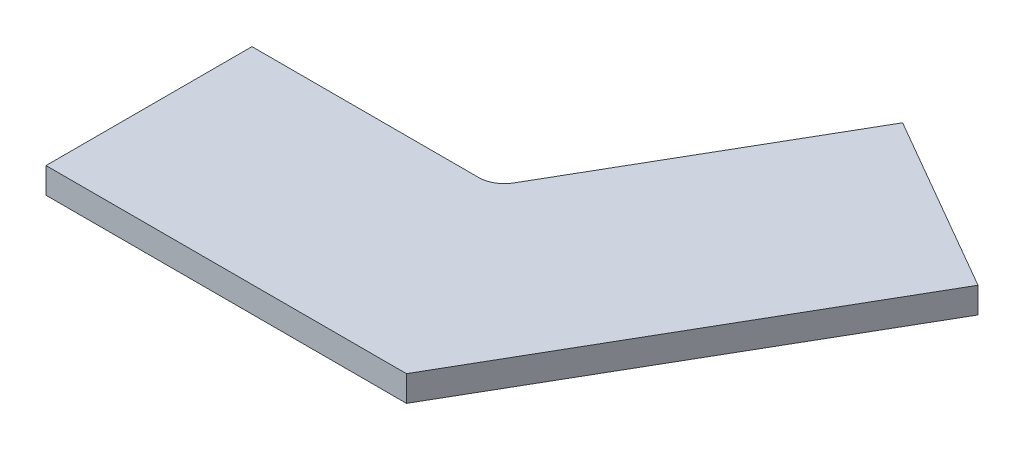
ISO-10303-21;
HEADER;
FILE_DESCRIPTION(('STEP AP214'),'2;1');
FILE_NAME('part.step','',(''),(''),'','','');
FILE_SCHEMA(('AUTOMOTIVE_DESIGN { 1 0 10303 214 1 1 1 1 }'));
ENDSEC;
DATA;
#1=APPLICATION_CONTEXT('core data for automotive mechanical design processes');
#2=APPLICATION_PROTOCOL_DEFINITION('international standard','automotive_design',2000,#1);
#3=PRODUCT_CONTEXT('',#1,'mechanical');
#4=PRODUCT('Part','Part','',(#3));
#5=PRODUCT_RELATED_PRODUCT_CATEGORY('part','',(#4));
#6=PRODUCT_DEFINITION_FORMATION('','',#4);
#7=PRODUCT_DEFINITION_CONTEXT('part definition',#1,'design');
#8=PRODUCT_DEFINITION('design','',#6,#7);
#9=PRODUCT_DEFINITION_SHAPE('','',#8);
#10=(LENGTH_UNIT() NAMED_UNIT(*) SI_UNIT(.MILLI.,.METRE.));
#11=(NAMED_UNIT(*) PLANE_ANGLE_UNIT() SI_UNIT($,.RADIAN.));
#12=(NAMED_UNIT(*) SI_UNIT($,.STERADIAN.) SOLID_ANGLE_UNIT());
#13=UNCERTAINTY_MEASURE_WITH_UNIT(LENGTH_MEASURE(1.E-05),#10,'distance_accuracy_value','');
#14=(GEOMETRIC_REPRESENTATION_CONTEXT(3) GLOBAL_UNCERTAINTY_ASSIGNED_CONTEXT((#13)) GLOBAL_UNIT_ASSIGNED_CONTEXT((#10,
#11,#12)) REPRESENTATION_CONTEXT('',''));
#15=CARTESIAN_POINT('',(0.,0.,0.));
#16=DIRECTION('',(0.,0.,1.));
#17=DIRECTION('',(1.,0.,0.));
#18=AXIS2_PLACEMENT_3D('',#15,#16,#17);
#19=CARTESIAN_POINT('',(0.,6.35,0.));
#20=DIRECTION('',(0.,1.,0.));
#21=DIRECTION('',(0.,0.,1.));
#22=AXIS2_PLACEMENT_3D('',#19,#20,#21);
#23=PLANE('',#22);
#24=DIRECTION('',(-0.500000000000017,0.,0.866025403784429));
#25=VECTOR('',#24,1.);
#26=CARTESIAN_POINT('',(7.59965948774994,6.35,-114.762996353));
#27=LINE('',#26,#25);
#28=CARTESIAN_POINT('',(-27.4963065701523,6.35,-53.9750000000121));
#29=VERTEX_POINT('',#28);
#30=CARTESIAN_POINT('',(7.59965948775127,6.35,-114.762996353001));
#31=VERTEX_POINT('',#30);
#32=EDGE_CURVE('E62',#29,#31,#27,.F.);
#33=ORIENTED_EDGE('',*,*,#32,.F.);
#34=CARTESIAN_POINT('',(-32.9955678841958,6.35,-57.15));
#35=DIRECTION('',(0.,1.,0.));
#36=DIRECTION('',(0.,0.,1.));
#37=AXIS2_PLACEMENT_3D('',#34,#35,#36);
#38=CIRCLE('',#37,6.35);
#39=CARTESIAN_POINT('',(-32.9955678841958,6.35,-50.8));
#40=VERTEX_POINT('',#39);
#41=EDGE_CURVE('E36',#29,#40,#38,.F.);
#42=ORIENTED_EDGE('',*,*,#41,.T.);
#43=DIRECTION('',(-1.,0.,0.));
#44=VECTOR('',#43,1.);
#45=CARTESIAN_POINT('',(-29.3293936748266,6.35,-50.8));
#46=LINE('',#45,#44);
#47=CARTESIAN_POINT('',(-88.9,6.35,-50.8000000000003));
#48=VERTEX_POINT('',#47);
#49=EDGE_CURVE('E114',#48,#40,#46,.F.);
#50=ORIENTED_EDGE('',*,*,#49,.F.);
#51=DIRECTION('',(0.,0.,1.));
#52=VECTOR('',#51,1.);
#53=CARTESIAN_POINT('',(-88.9,6.35,-50.8));
#54=LINE('',#53,#52);
#55=CARTESIAN_POINT('',(-88.9,6.35,0.));
#56=VERTEX_POINT('',#55);
#57=EDGE_CURVE('E103',#56,#48,#54,.F.);
#58=ORIENTED_EDGE('',*,*,#57,.F.);
#59=DIRECTION('',(1.,0.,0.));
#60=VECTOR('',#59,1.);
#61=CARTESIAN_POINT('',(-88.9,6.35,0.));
#62=LINE('',#61,#60);
#63=CARTESIAN_POINT('',(0.,6.35,0.));
#64=VERTEX_POINT('',#63);
#65=EDGE_CURVE('E111',#64,#56,#62,.F.);
#66=ORIENTED_EDGE('',*,*,#65,.F.);
#67=DIRECTION('',(0.500000000000017,0.,-0.866025403784429));
#68=VECTOR('',#67,1.);
#69=CARTESIAN_POINT('',(0.,6.35,0.));
#70=LINE('',#69,#68);
#71=CARTESIAN_POINT('',(51.5937499999988,6.35,-89.3629963530003));
#72=VERTEX_POINT('',#71);
#73=EDGE_CURVE('E138',#72,#64,#70,.F.);
#74=ORIENTED_EDGE('',*,*,#73,.F.);
#75=DIRECTION('',(-0.866025403784429,0.,-0.500000000000017));
#76=VECTOR('',#75,1.);
#77=CARTESIAN_POINT('',(51.59375,6.35,-89.3629963529996));
#78=LINE('',#77,#76);
#79=EDGE_CURVE('E135',#31,#72,#78,.F.);
#80=ORIENTED_EDGE('',*,*,#79,.F.);
#81=EDGE_LOOP('',(#33,#42,#50,#58,#66,#74,#80));
#82=FACE_BOUND('',#81,.T.);
#83=ADVANCED_FACE('F33',(#82),#23,.T.);
#84=CARTESIAN_POINT('',(-88.9,0.,-50.8));
#85=DIRECTION('',(-1.,0.,0.));
#86=DIRECTION('',(0.,0.,1.));
#87=AXIS2_PLACEMENT_3D('',#84,#85,#86);
#88=PLANE('',#87);
#89=DIRECTION('',(0.,0.,1.));
#90=VECTOR('',#89,1.);
#91=CARTESIAN_POINT('',(-88.9,0.,0.));
#92=LINE('',#91,#90);
#93=CARTESIAN_POINT('',(-88.9,0.,-50.8000000000003));
#94=VERTEX_POINT('',#93);
#95=CARTESIAN_POINT('',(-88.9,0.,0.));
#96=VERTEX_POINT('',#95);
#97=EDGE_CURVE('E86',#94,#96,#92,.T.);
#98=ORIENTED_EDGE('',*,*,#97,.T.);
#99=DIRECTION('',(0.,1.,0.));
#100=VECTOR('',#99,1.);
#101=CARTESIAN_POINT('',(-88.9,-181.408486904502,0.));
#102=LINE('',#101,#100);
#103=EDGE_CURVE('E109',#96,#56,#102,.T.);
#104=ORIENTED_EDGE('',*,*,#103,.T.);
#105=ORIENTED_EDGE('',*,*,#57,.T.);
#106=DIRECTION('',(0.,1.,0.));
#107=VECTOR('',#106,1.);
#108=CARTESIAN_POINT('',(-88.9,-181.408486904502,-50.8000000000003));
#109=LINE('',#108,#107);
#110=EDGE_CURVE('E107',#94,#48,#109,.T.);
#111=ORIENTED_EDGE('',*,*,#110,.F.);
#112=EDGE_LOOP('',(#98,#104,#105,#111));
#113=FACE_BOUND('',#112,.T.);
#114=ADVANCED_FACE('F105',(#113),#88,.T.);
#115=CARTESIAN_POINT('',(-88.9,0.,0.));
#116=DIRECTION('',(0.,0.,1.));
#117=DIRECTION('',(1.,0.,0.));
#118=AXIS2_PLACEMENT_3D('',#115,#116,#117);
#119=PLANE('',#118);
#120=DIRECTION('',(1.,0.,0.));
#121=VECTOR('',#120,1.);
#122=CARTESIAN_POINT('',(0.,0.,0.));
#123=LINE('',#122,#121);
#124=CARTESIAN_POINT('',(0.,0.,0.));
#125=VERTEX_POINT('',#124);
#126=EDGE_CURVE('E71',#96,#125,#123,.T.);
#127=ORIENTED_EDGE('',*,*,#126,.T.);
#128=DIRECTION('',(0.,1.,0.));
#129=VECTOR('',#128,1.);
#130=CARTESIAN_POINT('',(0.,-181.408486904502,0.));
#131=LINE('',#130,#129);
#132=EDGE_CURVE('E118',#125,#64,#131,.T.);
#133=ORIENTED_EDGE('',*,*,#132,.T.);
#134=ORIENTED_EDGE('',*,*,#65,.T.);
#135=ORIENTED_EDGE('',*,*,#103,.F.);
#136=EDGE_LOOP('',(#127,#133,#134,#135));
#137=FACE_BOUND('',#136,.T.);
#138=ADVANCED_FACE('F157',(#137),#119,.T.);
#139=CARTESIAN_POINT('',(0.,0.,0.));
#140=DIRECTION('',(0.866025403784429,0.,0.500000000000017));
#141=DIRECTION('',(0.500000000000017,0.,-0.866025403784429));
#142=AXIS2_PLACEMENT_3D('',#139,#140,#141);
#143=PLANE('',#142);
#144=DIRECTION('',(0.500000000000015,0.,-0.86602540378443));
#145=VECTOR('',#144,1.);
#146=CARTESIAN_POINT('',(1.83308710467622,0.,-3.17499999999746));
#147=LINE('',#146,#145);
#148=CARTESIAN_POINT('',(51.5937499999986,0.,-89.3629963530003));
#149=VERTEX_POINT('',#148);
#150=EDGE_CURVE('E125',#125,#149,#147,.T.);
#151=ORIENTED_EDGE('',*,*,#150,.T.);
#152=DIRECTION('',(0.,1.,0.));
#153=VECTOR('',#152,1.);
#154=CARTESIAN_POINT('',(51.5937499999988,-181.408486904502,-89.3629963530003));
#155=LINE('',#154,#153);
#156=EDGE_CURVE('E150',#149,#72,#155,.T.);
#157=ORIENTED_EDGE('',*,*,#156,.T.);
#158=ORIENTED_EDGE('',*,*,#73,.T.);
#159=ORIENTED_EDGE('',*,*,#132,.F.);
#160=EDGE_LOOP('',(#151,#157,#158,#159));
#161=FACE_BOUND('',#160,.T.);
#162=ADVANCED_FACE('F159',(#161),#143,.T.);
#163=CARTESIAN_POINT('',(51.59375,0.,-89.3629963529996));
#164=DIRECTION('',(0.500000000000017,0.,-0.866025403784429));
#165=DIRECTION('',(-0.866025403784429,0.,-0.500000000000017));
#166=AXIS2_PLACEMENT_3D('',#163,#164,#165);
#167=PLANE('',#166);
#168=ORIENTED_EDGE('',*,*,#79,.T.);
#169=ORIENTED_EDGE('',*,*,#156,.F.);
#170=DIRECTION('',(-0.866025403784612,0.,-0.499999999999699));
#171=VECTOR('',#170,1.);
#172=CARTESIAN_POINT('',(46.094488685997,0.,-92.5379963529996));
#173=LINE('',#172,#171);
#174=CARTESIAN_POINT('',(7.59965948775127,0.,-114.762996353));
#175=VERTEX_POINT('',#174);
#176=EDGE_CURVE('E123',#149,#175,#173,.T.);
#177=ORIENTED_EDGE('',*,*,#176,.T.);
#178=DIRECTION('',(0.,1.,0.));
#179=VECTOR('',#178,1.);
#180=CARTESIAN_POINT('',(7.59965948775127,-181.408486904502,-114.762996353001));
#181=LINE('',#180,#179);
#182=EDGE_CURVE('E112',#175,#31,#181,.T.);
#183=ORIENTED_EDGE('',*,*,#182,.T.);
#184=EDGE_LOOP('',(#168,#169,#177,#183));
#185=FACE_BOUND('',#184,.T.);
#186=ADVANCED_FACE('F161',(#185),#167,.T.);
#187=CARTESIAN_POINT('',(7.59965948774994,0.,-114.762996353));
#188=DIRECTION('',(-0.866025403784429,0.,-0.500000000000017));
#189=DIRECTION('',(-0.500000000000017,0.,0.866025403784429));
#190=AXIS2_PLACEMENT_3D('',#187,#188,#189);
#191=PLANE('',#190);
#192=DIRECTION('',(0.,1.,0.));
#193=VECTOR('',#192,1.);
#194=CARTESIAN_POINT('',(-27.496306570148,-8.27786,-53.9750000000288));
#195=LINE('',#194,#193);
#196=CARTESIAN_POINT('',(-27.4963065701534,0.,-53.9750000000126));
#197=VERTEX_POINT('',#196);
#198=EDGE_CURVE('E131',#197,#29,#195,.T.);
#199=ORIENTED_EDGE('',*,*,#198,.T.);
#200=ORIENTED_EDGE('',*,*,#32,.T.);
#201=ORIENTED_EDGE('',*,*,#182,.F.);
#202=DIRECTION('',(-0.500000000000032,0.,0.86602540378442));
#203=VECTOR('',#202,1.);
#204=CARTESIAN_POINT('',(4.42465948774994,0.,-109.263735038971));
#205=LINE('',#204,#203);
#206=EDGE_CURVE('E82',#175,#197,#205,.T.);
#207=ORIENTED_EDGE('',*,*,#206,.T.);
#208=EDGE_LOOP('',(#199,#200,#201,#207));
#209=FACE_BOUND('',#208,.T.);
#210=ADVANCED_FACE('F147',(#209),#191,.T.);
#211=CARTESIAN_POINT('',(-32.9955678841958,-8.27786,-57.15));
#212=DIRECTION('',(0.,1.,0.));
#213=DIRECTION('',(0.,0.,1.));
#214=AXIS2_PLACEMENT_3D('',#211,#212,#213);
#215=CYLINDRICAL_SURFACE('',#214,6.35);
#216=ORIENTED_EDGE('',*,*,#41,.F.);
#217=ORIENTED_EDGE('',*,*,#198,.F.);
#218=CARTESIAN_POINT('',(-32.9955678841958,0.,-57.15));
#219=DIRECTION('',(0.,1.,0.));
#220=DIRECTION('',(0.,0.,1.));
#221=AXIS2_PLACEMENT_3D('',#218,#219,#220);
#222=CIRCLE('',#221,6.35);
#223=CARTESIAN_POINT('',(-32.9955678841958,0.,-50.8));
#224=VERTEX_POINT('',#223);
#225=EDGE_CURVE('E42',#197,#224,#222,.F.);
#226=ORIENTED_EDGE('',*,*,#225,.T.);
#227=DIRECTION('',(0.,1.,0.));
#228=VECTOR('',#227,1.);
#229=CARTESIAN_POINT('',(-32.9955678841958,0.,-50.8));
#230=LINE('',#229,#228);
#231=EDGE_CURVE('E50',#40,#224,#230,.F.);
#232=ORIENTED_EDGE('',*,*,#231,.F.);
#233=EDGE_LOOP('',(#216,#217,#226,#232));
#234=FACE_BOUND('',#233,.T.);
#235=ADVANCED_FACE('F143',(#234),#215,.F.);
#236=CARTESIAN_POINT('',(-29.3293936748266,0.,-50.8));
#237=DIRECTION('',(0.,0.,-1.));
#238=DIRECTION('',(-1.,0.,0.));
#239=AXIS2_PLACEMENT_3D('',#236,#237,#238);
#240=PLANE('',#239);
#241=ORIENTED_EDGE('',*,*,#231,.T.);
#242=DIRECTION('',(1.,0.,0.));
#243=VECTOR('',#242,1.);
#244=CARTESIAN_POINT('',(0.,0.,-50.8));
#245=LINE('',#244,#243);
#246=EDGE_CURVE('E11',#224,#94,#245,.F.);
#247=ORIENTED_EDGE('',*,*,#246,.T.);
#248=ORIENTED_EDGE('',*,*,#110,.T.);
#249=ORIENTED_EDGE('',*,*,#49,.T.);
#250=EDGE_LOOP('',(#241,#247,#248,#249));
#251=FACE_BOUND('',#250,.T.);
#252=ADVANCED_FACE('F116',(#251),#240,.T.);
#253=CARTESIAN_POINT('',(0.,0.,0.));
#254=DIRECTION('',(0.,1.,0.));
#255=DIRECTION('',(0.,0.,1.));
#256=AXIS2_PLACEMENT_3D('',#253,#254,#255);
#257=PLANE('',#256);
#258=ORIENTED_EDGE('',*,*,#225,.F.);
#259=ORIENTED_EDGE('',*,*,#206,.F.);
#260=ORIENTED_EDGE('',*,*,#176,.F.);
#261=ORIENTED_EDGE('',*,*,#150,.F.);
#262=ORIENTED_EDGE('',*,*,#126,.F.);
#263=ORIENTED_EDGE('',*,*,#97,.F.);
#264=ORIENTED_EDGE('',*,*,#246,.F.);
#265=EDGE_LOOP('',(#258,#259,#260,#261,#262,#263,#264));
#266=FACE_BOUND('',#265,.T.);
#267=ADVANCED_FACE('F144',(#266),#257,.F.);
#268=CLOSED_SHELL('',(#83,#114,#138,#162,#186,#210,#235,#252,#267));
#269=MANIFOLD_SOLID_BREP('B2',#268);
#270=ADVANCED_BREP_SHAPE_REPRESENTATION('',(#18,#269),#14);
#271=SHAPE_DEFINITION_REPRESENTATION(#9,#270);
ENDSEC;
END-ISO-10303-21;
